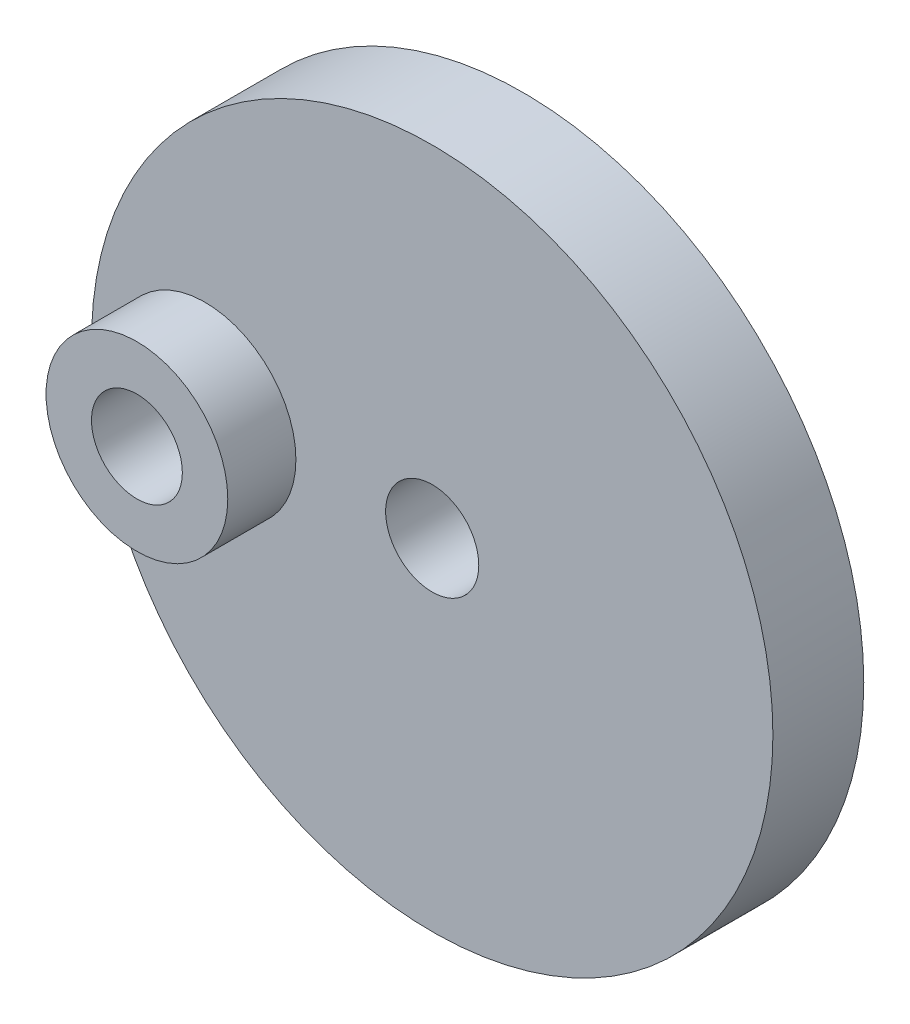
ISO-10303-21;
HEADER;
FILE_DESCRIPTION(('STEP AP214'),'2;1');
FILE_NAME('part.step','',(''),(''),'','','');
FILE_SCHEMA(('AUTOMOTIVE_DESIGN { 1 0 10303 214 1 1 1 1 }'));
ENDSEC;
DATA;
#1=APPLICATION_CONTEXT('core data for automotive mechanical design processes');
#2=APPLICATION_PROTOCOL_DEFINITION('international standard','automotive_design',2000,#1);
#3=PRODUCT_CONTEXT('',#1,'mechanical');
#4=PRODUCT('Part','Part','',(#3));
#5=PRODUCT_RELATED_PRODUCT_CATEGORY('part','',(#4));
#6=PRODUCT_DEFINITION_FORMATION('','',#4);
#7=PRODUCT_DEFINITION_CONTEXT('part definition',#1,'design');
#8=PRODUCT_DEFINITION('design','',#6,#7);
#9=PRODUCT_DEFINITION_SHAPE('','',#8);
#10=(LENGTH_UNIT() NAMED_UNIT(*) SI_UNIT(.MILLI.,.METRE.));
#11=(NAMED_UNIT(*) PLANE_ANGLE_UNIT() SI_UNIT($,.RADIAN.));
#12=(NAMED_UNIT(*) SI_UNIT($,.STERADIAN.) SOLID_ANGLE_UNIT());
#13=UNCERTAINTY_MEASURE_WITH_UNIT(LENGTH_MEASURE(1.E-05),#10,'distance_accuracy_value','');
#14=(GEOMETRIC_REPRESENTATION_CONTEXT(3) GLOBAL_UNCERTAINTY_ASSIGNED_CONTEXT((#13)) GLOBAL_UNIT_ASSIGNED_CONTEXT((#10,
#11,#12)) REPRESENTATION_CONTEXT('',''));
#15=CARTESIAN_POINT('',(0.,0.,0.));
#16=DIRECTION('',(0.,0.,1.));
#17=DIRECTION('',(1.,0.,0.));
#18=AXIS2_PLACEMENT_3D('',#15,#16,#17);
#19=CARTESIAN_POINT('',(-20.,0.,42.6274169979695));
#20=DIRECTION('',(0.,0.,-1.));
#21=DIRECTION('',(-1.,0.,0.));
#22=AXIS2_PLACEMENT_3D('',#19,#20,#21);
#23=CYLINDRICAL_SURFACE('',#22,8.);
#24=CARTESIAN_POINT('',(-20.,0.,0.));
#25=DIRECTION('',(0.,0.,1.));
#26=DIRECTION('',(1.,0.,0.));
#27=AXIS2_PLACEMENT_3D('',#24,#25,#26);
#28=CIRCLE('',#27,8.);
#29=CARTESIAN_POINT('',(-12.,0.,0.));
#30=VERTEX_POINT('',#29);
#31=EDGE_CURVE('E54',#30,#30,#28,.T.);
#32=ORIENTED_EDGE('',*,*,#31,.T.);
#33=EDGE_LOOP('',(#32));
#34=FACE_BOUND('',#33,.T.);
#35=CARTESIAN_POINT('',(-20.,0.,14.));
#36=DIRECTION('',(0.,0.,1.));
#37=DIRECTION('',(1.,0.,0.));
#38=AXIS2_PLACEMENT_3D('',#35,#36,#37);
#39=CIRCLE('',#38,8.);
#40=CARTESIAN_POINT('',(-12.,0.,14.));
#41=VERTEX_POINT('',#40);
#42=EDGE_CURVE('E11',#41,#41,#39,.T.);
#43=ORIENTED_EDGE('',*,*,#42,.F.);
#44=EDGE_LOOP('',(#43));
#45=FACE_BOUND('',#44,.T.);
#46=ADVANCED_FACE('F42',(#34,#45),#23,.T.);
#47=CARTESIAN_POINT('',(0.,0.,0.));
#48=DIRECTION('',(0.,0.,1.));
#49=DIRECTION('',(1.,0.,0.));
#50=AXIS2_PLACEMENT_3D('',#47,#48,#49);
#51=PLANE('',#50);
#52=ORIENTED_EDGE('',*,*,#31,.F.);
#53=EDGE_LOOP('',(#52));
#54=FACE_BOUND('',#53,.T.);
#55=CARTESIAN_POINT('',(-20.,0.,0.));
#56=DIRECTION('',(0.,0.,1.));
#57=DIRECTION('',(1.,0.,0.));
#58=AXIS2_PLACEMENT_3D('',#55,#56,#57);
#59=CIRCLE('',#58,4.);
#60=CARTESIAN_POINT('',(-16.,0.,0.));
#61=VERTEX_POINT('',#60);
#62=EDGE_CURVE('E49',#61,#61,#59,.T.);
#63=ORIENTED_EDGE('',*,*,#62,.T.);
#64=EDGE_LOOP('',(#63));
#65=FACE_BOUND('',#64,.T.);
#66=ADVANCED_FACE('F70',(#54,#65),#51,.F.);
#67=CARTESIAN_POINT('',(-20.,0.,42.6274169979695));
#68=DIRECTION('',(0.,0.,-1.));
#69=DIRECTION('',(-1.,0.,0.));
#70=AXIS2_PLACEMENT_3D('',#67,#68,#69);
#71=CYLINDRICAL_SURFACE('',#70,4.);
#72=ORIENTED_EDGE('',*,*,#62,.F.);
#73=EDGE_LOOP('',(#72));
#74=FACE_BOUND('',#73,.T.);
#75=CARTESIAN_POINT('',(-20.,0.,14.));
#76=DIRECTION('',(0.,0.,1.));
#77=DIRECTION('',(1.,0.,0.));
#78=AXIS2_PLACEMENT_3D('',#75,#76,#77);
#79=CIRCLE('',#78,4.);
#80=CARTESIAN_POINT('',(-16.,0.,14.));
#81=VERTEX_POINT('',#80);
#82=EDGE_CURVE('E45',#81,#81,#79,.T.);
#83=ORIENTED_EDGE('',*,*,#82,.T.);
#84=EDGE_LOOP('',(#83));
#85=FACE_BOUND('',#84,.T.);
#86=ADVANCED_FACE('F62',(#74,#85),#71,.F.);
#87=CARTESIAN_POINT('',(0.,0.,14.));
#88=DIRECTION('',(0.,0.,1.));
#89=DIRECTION('',(1.,0.,0.));
#90=AXIS2_PLACEMENT_3D('',#87,#88,#89);
#91=PLANE('',#90);
#92=ORIENTED_EDGE('',*,*,#82,.F.);
#93=EDGE_LOOP('',(#92));
#94=FACE_BOUND('',#93,.T.);
#95=ORIENTED_EDGE('',*,*,#42,.T.);
#96=EDGE_LOOP('',(#95));
#97=FACE_BOUND('',#96,.T.);
#98=ADVANCED_FACE('F64',(#94,#97),#91,.T.);
#99=CLOSED_SHELL('',(#46,#66,#86,#98));
#100=MANIFOLD_SOLID_BREP('B2',#99);
#101=CARTESIAN_POINT('',(-20.,0.,8.));
#102=DIRECTION('',(0.,0.,-1.));
#103=DIRECTION('',(-1.,0.,0.));
#104=AXIS2_PLACEMENT_3D('',#101,#102,#103);
#105=CYLINDRICAL_SURFACE('',#104,8.);
#106=CARTESIAN_POINT('',(-20.,0.,8.));
#107=DIRECTION('',(0.,0.,1.));
#108=DIRECTION('',(1.,0.,0.));
#109=AXIS2_PLACEMENT_3D('',#106,#107,#108);
#110=CIRCLE('',#109,8.);
#111=CARTESIAN_POINT('',(-12.,0.,8.));
#112=VERTEX_POINT('',#111);
#113=EDGE_CURVE('E113',#112,#112,#110,.T.);
#114=ORIENTED_EDGE('',*,*,#113,.T.);
#115=EDGE_LOOP('',(#114));
#116=FACE_BOUND('',#115,.T.);
#117=CARTESIAN_POINT('',(-20.,0.,0.));
#118=DIRECTION('',(0.,0.,1.));
#119=DIRECTION('',(1.,0.,0.));
#120=AXIS2_PLACEMENT_3D('',#117,#118,#119);
#121=CIRCLE('',#120,8.);
#122=CARTESIAN_POINT('',(-12.,0.,0.));
#123=VERTEX_POINT('',#122);
#124=EDGE_CURVE('E124',#123,#123,#121,.T.);
#125=ORIENTED_EDGE('',*,*,#124,.F.);
#126=EDGE_LOOP('',(#125));
#127=FACE_BOUND('',#126,.T.);
#128=ADVANCED_FACE('F105',(#116,#127),#105,.F.);
#129=CARTESIAN_POINT('',(0.,0.,8.));
#130=DIRECTION('',(0.,0.,-1.));
#131=DIRECTION('',(-1.,0.,0.));
#132=AXIS2_PLACEMENT_3D('',#129,#130,#131);
#133=CYLINDRICAL_SURFACE('',#132,4.1);
#134=CARTESIAN_POINT('',(0.,0.,8.));
#135=DIRECTION('',(0.,0.,1.));
#136=DIRECTION('',(1.,0.,0.));
#137=AXIS2_PLACEMENT_3D('',#134,#135,#136);
#138=CIRCLE('',#137,4.1);
#139=CARTESIAN_POINT('',(4.1,0.,8.));
#140=VERTEX_POINT('',#139);
#141=EDGE_CURVE('E118',#140,#140,#138,.T.);
#142=ORIENTED_EDGE('',*,*,#141,.T.);
#143=EDGE_LOOP('',(#142));
#144=FACE_BOUND('',#143,.T.);
#145=CARTESIAN_POINT('',(0.,0.,0.));
#146=DIRECTION('',(0.,0.,1.));
#147=DIRECTION('',(1.,0.,0.));
#148=AXIS2_PLACEMENT_3D('',#145,#146,#147);
#149=CIRCLE('',#148,4.1);
#150=CARTESIAN_POINT('',(4.1,0.,0.));
#151=VERTEX_POINT('',#150);
#152=EDGE_CURVE('E122',#151,#151,#149,.T.);
#153=ORIENTED_EDGE('',*,*,#152,.F.);
#154=EDGE_LOOP('',(#153));
#155=FACE_BOUND('',#154,.T.);
#156=ADVANCED_FACE('F107',(#144,#155),#133,.F.);
#157=CARTESIAN_POINT('',(0.,0.,8.));
#158=DIRECTION('',(0.,0.,-1.));
#159=DIRECTION('',(-1.,0.,0.));
#160=AXIS2_PLACEMENT_3D('',#157,#158,#159);
#161=CYLINDRICAL_SURFACE('',#160,30.);
#162=CARTESIAN_POINT('',(0.,0.,8.));
#163=DIRECTION('',(0.,0.,1.));
#164=DIRECTION('',(1.,0.,0.));
#165=AXIS2_PLACEMENT_3D('',#162,#163,#164);
#166=CIRCLE('',#165,30.);
#167=CARTESIAN_POINT('',(30.,0.,8.));
#168=VERTEX_POINT('',#167);
#169=EDGE_CURVE('E41',#168,#168,#166,.T.);
#170=ORIENTED_EDGE('',*,*,#169,.F.);
#171=EDGE_LOOP('',(#170));
#172=FACE_BOUND('',#171,.T.);
#173=CARTESIAN_POINT('',(0.,0.,0.));
#174=DIRECTION('',(0.,0.,1.));
#175=DIRECTION('',(1.,0.,0.));
#176=AXIS2_PLACEMENT_3D('',#173,#174,#175);
#177=CIRCLE('',#176,30.);
#178=CARTESIAN_POINT('',(30.,0.,0.));
#179=VERTEX_POINT('',#178);
#180=EDGE_CURVE('E109',#179,#179,#177,.T.);
#181=ORIENTED_EDGE('',*,*,#180,.T.);
#182=EDGE_LOOP('',(#181));
#183=FACE_BOUND('',#182,.T.);
#184=ADVANCED_FACE('F140',(#172,#183),#161,.T.);
#185=CARTESIAN_POINT('',(0.,0.,8.));
#186=DIRECTION('',(0.,0.,1.));
#187=DIRECTION('',(1.,0.,0.));
#188=AXIS2_PLACEMENT_3D('',#185,#186,#187);
#189=PLANE('',#188);
#190=ORIENTED_EDGE('',*,*,#141,.F.);
#191=EDGE_LOOP('',(#190));
#192=FACE_BOUND('',#191,.T.);
#193=ORIENTED_EDGE('',*,*,#113,.F.);
#194=EDGE_LOOP('',(#193));
#195=FACE_BOUND('',#194,.T.);
#196=ORIENTED_EDGE('',*,*,#169,.T.);
#197=EDGE_LOOP('',(#196));
#198=FACE_BOUND('',#197,.T.);
#199=ADVANCED_FACE('F136',(#192,#195,#198),#189,.T.);
#200=CARTESIAN_POINT('',(0.,0.,0.));
#201=DIRECTION('',(0.,0.,1.));
#202=DIRECTION('',(1.,0.,0.));
#203=AXIS2_PLACEMENT_3D('',#200,#201,#202);
#204=PLANE('',#203);
#205=ORIENTED_EDGE('',*,*,#152,.T.);
#206=EDGE_LOOP('',(#205));
#207=FACE_BOUND('',#206,.T.);
#208=ORIENTED_EDGE('',*,*,#124,.T.);
#209=EDGE_LOOP('',(#208));
#210=FACE_BOUND('',#209,.T.);
#211=ORIENTED_EDGE('',*,*,#180,.F.);
#212=EDGE_LOOP('',(#211));
#213=FACE_BOUND('',#212,.T.);
#214=ADVANCED_FACE('F139',(#207,#210,#213),#204,.F.);
#215=CLOSED_SHELL('',(#128,#156,#184,#199,#214));
#216=MANIFOLD_SOLID_BREP('B6',#215);
#217=ADVANCED_BREP_SHAPE_REPRESENTATION('',(#18,#100,#216),#14);
#218=SHAPE_DEFINITION_REPRESENTATION(#9,#217);
ENDSEC;
END-ISO-10303-21;
